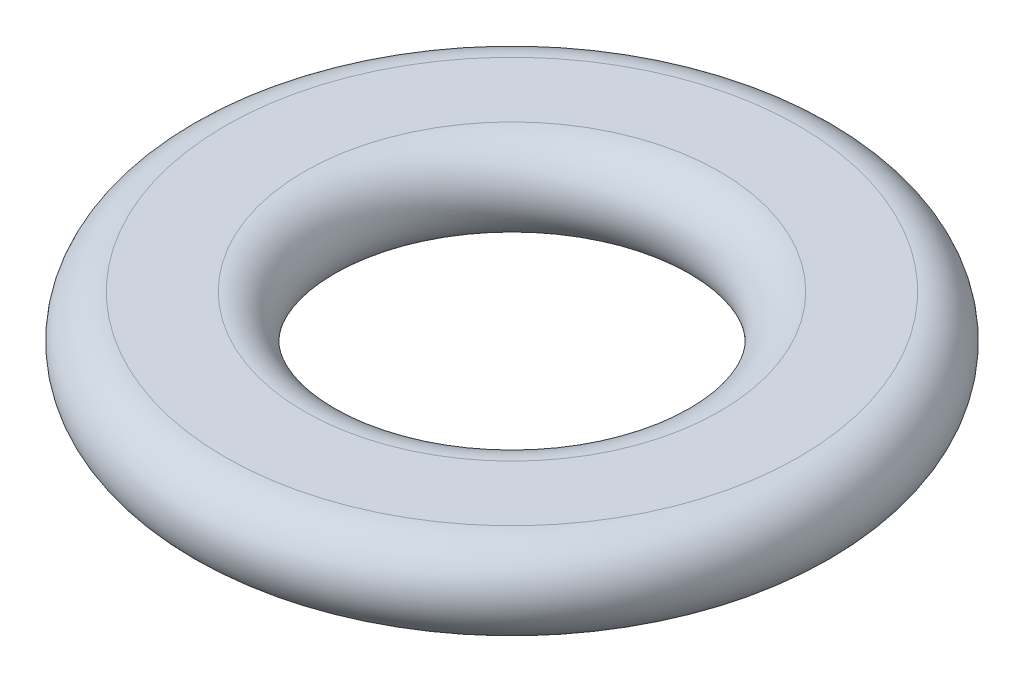
ISO-10303-21;
HEADER;
FILE_DESCRIPTION(('STEP AP214'),'2;1');
FILE_NAME('part.step','',(''),(''),'','','');
FILE_SCHEMA(('AUTOMOTIVE_DESIGN { 1 0 10303 214 1 1 1 1 }'));
ENDSEC;
DATA;
#1=APPLICATION_CONTEXT('core data for automotive mechanical design processes');
#2=APPLICATION_PROTOCOL_DEFINITION('international standard','automotive_design',2000,#1);
#3=PRODUCT_CONTEXT('',#1,'mechanical');
#4=PRODUCT('Part','Part','',(#3));
#5=PRODUCT_RELATED_PRODUCT_CATEGORY('part','',(#4));
#6=PRODUCT_DEFINITION_FORMATION('','',#4);
#7=PRODUCT_DEFINITION_CONTEXT('part definition',#1,'design');
#8=PRODUCT_DEFINITION('design','',#6,#7);
#9=PRODUCT_DEFINITION_SHAPE('','',#8);
#10=(LENGTH_UNIT() NAMED_UNIT(*) SI_UNIT(.MILLI.,.METRE.));
#11=(NAMED_UNIT(*) PLANE_ANGLE_UNIT() SI_UNIT($,.RADIAN.));
#12=(NAMED_UNIT(*) SI_UNIT($,.STERADIAN.) SOLID_ANGLE_UNIT());
#13=UNCERTAINTY_MEASURE_WITH_UNIT(LENGTH_MEASURE(1.E-05),#10,'distance_accuracy_value','');
#14=(GEOMETRIC_REPRESENTATION_CONTEXT(3) GLOBAL_UNCERTAINTY_ASSIGNED_CONTEXT((#13)) GLOBAL_UNIT_ASSIGNED_CONTEXT((#10,
#11,#12)) REPRESENTATION_CONTEXT('',''));
#15=CARTESIAN_POINT('',(0.,0.,0.));
#16=DIRECTION('',(0.,0.,1.));
#17=DIRECTION('',(1.,0.,0.));
#18=AXIS2_PLACEMENT_3D('',#15,#16,#17);
#19=CARTESIAN_POINT('',(0.,0.,0.));
#20=DIRECTION('',(0.,1.,0.));
#21=DIRECTION('',(0.,0.,1.));
#22=AXIS2_PLACEMENT_3D('',#19,#20,#21);
#23=TOROIDAL_SURFACE('',#22,3.15,0.65);
#24=CARTESIAN_POINT('',(0.,-0.65,0.));
#25=DIRECTION('',(0.,1.,0.));
#26=DIRECTION('',(0.,0.,1.));
#27=AXIS2_PLACEMENT_3D('',#24,#25,#26);
#28=CIRCLE('',#27,3.15);
#29=CARTESIAN_POINT('',(0.,-0.65,3.15));
#30=VERTEX_POINT('',#29);
#31=EDGE_CURVE('E10',#30,#30,#28,.T.);
#32=ORIENTED_EDGE('',*,*,#31,.F.);
#33=EDGE_LOOP('',(#32));
#34=FACE_BOUND('',#33,.T.);
#35=CARTESIAN_POINT('',(0.,0.65,0.));
#36=DIRECTION('',(0.,1.,0.));
#37=DIRECTION('',(0.,0.,1.));
#38=AXIS2_PLACEMENT_3D('',#35,#36,#37);
#39=CIRCLE('',#38,3.15);
#40=CARTESIAN_POINT('',(0.,0.65,3.15));
#41=VERTEX_POINT('',#40);
#42=EDGE_CURVE('E29',#41,#41,#39,.T.);
#43=ORIENTED_EDGE('',*,*,#42,.T.);
#44=EDGE_LOOP('',(#43));
#45=FACE_BOUND('',#44,.T.);
#46=ADVANCED_FACE('F15',(#34,#45),#23,.T.);
#47=CARTESIAN_POINT('',(3.15,-0.65,0.));
#48=DIRECTION('',(0.,1.,0.));
#49=DIRECTION('',(0.,0.,1.));
#50=AXIS2_PLACEMENT_3D('',#47,#48,#49);
#51=PLANE('',#50);
#52=CARTESIAN_POINT('',(0.,-0.65,0.));
#53=DIRECTION('',(0.,1.,0.));
#54=DIRECTION('',(0.,0.,1.));
#55=AXIS2_PLACEMENT_3D('',#52,#53,#54);
#56=CIRCLE('',#55,4.35);
#57=CARTESIAN_POINT('',(0.,-0.65,4.35));
#58=VERTEX_POINT('',#57);
#59=EDGE_CURVE('E21',#58,#58,#56,.T.);
#60=ORIENTED_EDGE('',*,*,#59,.F.);
#61=EDGE_LOOP('',(#60));
#62=FACE_BOUND('',#61,.T.);
#63=ORIENTED_EDGE('',*,*,#31,.T.);
#64=EDGE_LOOP('',(#63));
#65=FACE_BOUND('',#64,.T.);
#66=ADVANCED_FACE('F44',(#62,#65),#51,.F.);
#67=CARTESIAN_POINT('',(0.,0.,0.));
#68=DIRECTION('',(0.,1.,0.));
#69=DIRECTION('',(0.,0.,1.));
#70=AXIS2_PLACEMENT_3D('',#67,#68,#69);
#71=TOROIDAL_SURFACE('',#70,4.35,0.65);
#72=CARTESIAN_POINT('',(0.,0.65,0.));
#73=DIRECTION('',(0.,1.,0.));
#74=DIRECTION('',(0.,0.,1.));
#75=AXIS2_PLACEMENT_3D('',#72,#73,#74);
#76=CIRCLE('',#75,4.35);
#77=CARTESIAN_POINT('',(0.,0.65,4.35));
#78=VERTEX_POINT('',#77);
#79=EDGE_CURVE('E25',#78,#78,#76,.T.);
#80=ORIENTED_EDGE('',*,*,#79,.F.);
#81=EDGE_LOOP('',(#80));
#82=FACE_BOUND('',#81,.T.);
#83=ORIENTED_EDGE('',*,*,#59,.T.);
#84=EDGE_LOOP('',(#83));
#85=FACE_BOUND('',#84,.T.);
#86=ADVANCED_FACE('F39',(#82,#85),#71,.T.);
#87=CARTESIAN_POINT('',(3.15,0.65,0.));
#88=DIRECTION('',(0.,-1.,0.));
#89=DIRECTION('',(0.,0.,-1.));
#90=AXIS2_PLACEMENT_3D('',#87,#88,#89);
#91=PLANE('',#90);
#92=ORIENTED_EDGE('',*,*,#42,.F.);
#93=EDGE_LOOP('',(#92));
#94=FACE_BOUND('',#93,.T.);
#95=ORIENTED_EDGE('',*,*,#79,.T.);
#96=EDGE_LOOP('',(#95));
#97=FACE_BOUND('',#96,.T.);
#98=ADVANCED_FACE('F36',(#94,#97),#91,.F.);
#99=CLOSED_SHELL('',(#46,#66,#86,#98));
#100=MANIFOLD_SOLID_BREP('B1',#99);
#101=ADVANCED_BREP_SHAPE_REPRESENTATION('',(#18,#100),#14);
#102=SHAPE_DEFINITION_REPRESENTATION(#9,#101);
ENDSEC;
END-ISO-10303-21;
